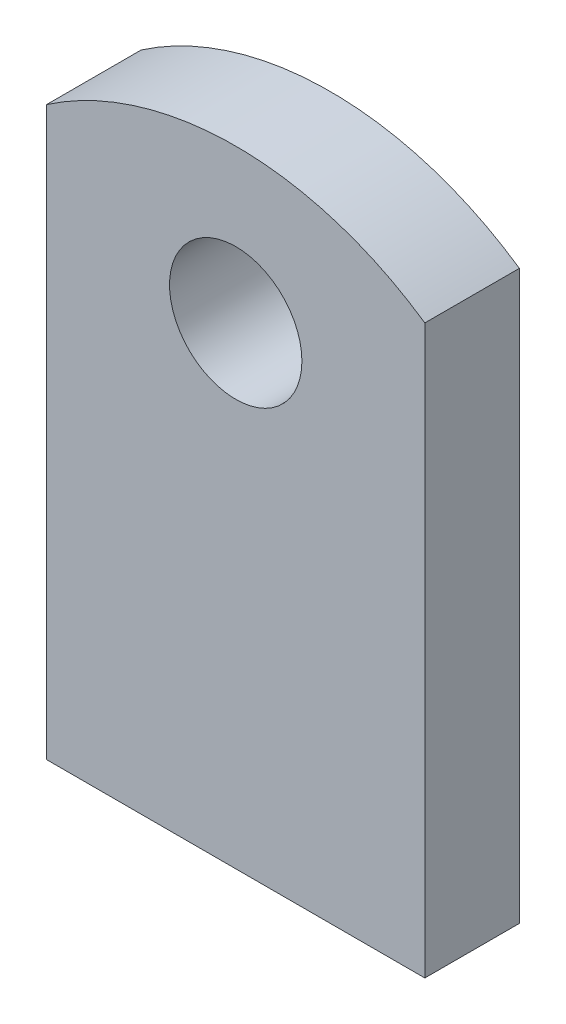
ISO-10303-21;
HEADER;
FILE_DESCRIPTION(('STEP AP214'),'2;1');
FILE_NAME('part.step','',(''),(''),'','','');
FILE_SCHEMA(('AUTOMOTIVE_DESIGN { 1 0 10303 214 1 1 1 1 }'));
ENDSEC;
DATA;
#1=APPLICATION_CONTEXT('core data for automotive mechanical design processes');
#2=APPLICATION_PROTOCOL_DEFINITION('international standard','automotive_design',2000,#1);
#3=PRODUCT_CONTEXT('',#1,'mechanical');
#4=PRODUCT('Part','Part','',(#3));
#5=PRODUCT_RELATED_PRODUCT_CATEGORY('part','',(#4));
#6=PRODUCT_DEFINITION_FORMATION('','',#4);
#7=PRODUCT_DEFINITION_CONTEXT('part definition',#1,'design');
#8=PRODUCT_DEFINITION('design','',#6,#7);
#9=PRODUCT_DEFINITION_SHAPE('','',#8);
#10=(LENGTH_UNIT() NAMED_UNIT(*) SI_UNIT(.MILLI.,.METRE.));
#11=(NAMED_UNIT(*) PLANE_ANGLE_UNIT() SI_UNIT($,.RADIAN.));
#12=(NAMED_UNIT(*) SI_UNIT($,.STERADIAN.) SOLID_ANGLE_UNIT());
#13=UNCERTAINTY_MEASURE_WITH_UNIT(LENGTH_MEASURE(1.E-05),#10,'distance_accuracy_value','');
#14=(GEOMETRIC_REPRESENTATION_CONTEXT(3) GLOBAL_UNCERTAINTY_ASSIGNED_CONTEXT((#13)) GLOBAL_UNIT_ASSIGNED_CONTEXT((#10,
#11,#12)) REPRESENTATION_CONTEXT('',''));
#15=CARTESIAN_POINT('',(0.,0.,0.));
#16=DIRECTION('',(0.,0.,1.));
#17=DIRECTION('',(1.,0.,0.));
#18=AXIS2_PLACEMENT_3D('',#15,#16,#17);
#19=CARTESIAN_POINT('',(0.,0.419794240135012,5.));
#20=DIRECTION('',(0.,0.,-1.));
#21=DIRECTION('',(-1.,0.,0.));
#22=AXIS2_PLACEMENT_3D('',#19,#20,#21);
#23=PLANE('',#22);
#24=CARTESIAN_POINT('',(0.,0.419794240135012,5.));
#25=DIRECTION('',(0.,0.,1.));
#26=DIRECTION('',(-1.,0.,0.));
#27=AXIS2_PLACEMENT_3D('',#24,#25,#26);
#28=CIRCLE('',#27,17.68);
#29=CARTESIAN_POINT('',(10.,15.,5.));
#30=VERTEX_POINT('',#29);
#31=CARTESIAN_POINT('',(-10.,15.,5.));
#32=VERTEX_POINT('',#31);
#33=EDGE_CURVE('E98',#30,#32,#28,.T.);
#34=ORIENTED_EDGE('',*,*,#33,.T.);
#35=DIRECTION('',(0.,-1.,0.));
#36=VECTOR('',#35,1.);
#37=CARTESIAN_POINT('',(-10.,-15.,5.));
#38=LINE('',#37,#36);
#39=CARTESIAN_POINT('',(-10.,-15.,5.));
#40=VERTEX_POINT('',#39);
#41=EDGE_CURVE('E93',#32,#40,#38,.T.);
#42=ORIENTED_EDGE('',*,*,#41,.T.);
#43=DIRECTION('',(1.,0.,0.));
#44=VECTOR('',#43,1.);
#45=CARTESIAN_POINT('',(10.,-15.,5.));
#46=LINE('',#45,#44);
#47=CARTESIAN_POINT('',(10.,-15.,5.));
#48=VERTEX_POINT('',#47);
#49=EDGE_CURVE('E96',#40,#48,#46,.T.);
#50=ORIENTED_EDGE('',*,*,#49,.T.);
#51=DIRECTION('',(0.,1.,0.));
#52=VECTOR('',#51,1.);
#53=CARTESIAN_POINT('',(10.,-15.,5.));
#54=LINE('',#53,#52);
#55=EDGE_CURVE('E63',#48,#30,#54,.T.);
#56=ORIENTED_EDGE('',*,*,#55,.T.);
#57=EDGE_LOOP('',(#34,#42,#50,#56));
#58=FACE_BOUND('',#57,.T.);
#59=CARTESIAN_POINT('',(0.,10.,5.));
#60=DIRECTION('',(0.,0.,1.));
#61=DIRECTION('',(1.,0.,0.));
#62=AXIS2_PLACEMENT_3D('',#59,#60,#61);
#63=CIRCLE('',#62,3.5);
#64=CARTESIAN_POINT('',(3.49999999999999,10.,5.));
#65=VERTEX_POINT('',#64);
#66=EDGE_CURVE('E118',#65,#65,#63,.T.);
#67=ORIENTED_EDGE('',*,*,#66,.F.);
#68=EDGE_LOOP('',(#67));
#69=FACE_BOUND('',#68,.T.);
#70=ADVANCED_FACE('F45',(#58,#69),#23,.F.);
#71=CARTESIAN_POINT('',(0.,0.419794240135012,0.));
#72=DIRECTION('',(0.,0.,-1.));
#73=DIRECTION('',(-1.,0.,0.));
#74=AXIS2_PLACEMENT_3D('',#71,#72,#73);
#75=PLANE('',#74);
#76=CARTESIAN_POINT('',(0.,0.419794240135012,0.));
#77=DIRECTION('',(0.,0.,1.));
#78=DIRECTION('',(-1.,0.,0.));
#79=AXIS2_PLACEMENT_3D('',#76,#77,#78);
#80=CIRCLE('',#79,17.68);
#81=CARTESIAN_POINT('',(10.,15.,0.));
#82=VERTEX_POINT('',#81);
#83=CARTESIAN_POINT('',(-10.,15.,0.));
#84=VERTEX_POINT('',#83);
#85=EDGE_CURVE('E114',#82,#84,#80,.T.);
#86=ORIENTED_EDGE('',*,*,#85,.F.);
#87=DIRECTION('',(0.,1.,0.));
#88=VECTOR('',#87,1.);
#89=CARTESIAN_POINT('',(10.,-15.,0.));
#90=LINE('',#89,#88);
#91=CARTESIAN_POINT('',(10.,-15.,0.));
#92=VERTEX_POINT('',#91);
#93=EDGE_CURVE('E86',#92,#82,#90,.T.);
#94=ORIENTED_EDGE('',*,*,#93,.F.);
#95=DIRECTION('',(1.,0.,0.));
#96=VECTOR('',#95,1.);
#97=CARTESIAN_POINT('',(10.,-15.,0.));
#98=LINE('',#97,#96);
#99=CARTESIAN_POINT('',(-10.,-15.,0.));
#100=VERTEX_POINT('',#99);
#101=EDGE_CURVE('E80',#100,#92,#98,.T.);
#102=ORIENTED_EDGE('',*,*,#101,.F.);
#103=DIRECTION('',(0.,-1.,0.));
#104=VECTOR('',#103,1.);
#105=CARTESIAN_POINT('',(-10.,-15.,0.));
#106=LINE('',#105,#104);
#107=EDGE_CURVE('E103',#84,#100,#106,.T.);
#108=ORIENTED_EDGE('',*,*,#107,.F.);
#109=EDGE_LOOP('',(#86,#94,#102,#108));
#110=FACE_BOUND('',#109,.T.);
#111=CARTESIAN_POINT('',(0.,10.,0.));
#112=DIRECTION('',(0.,0.,1.));
#113=DIRECTION('',(1.,0.,0.));
#114=AXIS2_PLACEMENT_3D('',#111,#112,#113);
#115=CIRCLE('',#114,3.5);
#116=CARTESIAN_POINT('',(3.49999999999999,10.,0.));
#117=VERTEX_POINT('',#116);
#118=EDGE_CURVE('E136',#117,#117,#115,.T.);
#119=ORIENTED_EDGE('',*,*,#118,.T.);
#120=EDGE_LOOP('',(#119));
#121=FACE_BOUND('',#120,.T.);
#122=ADVANCED_FACE('F131',(#110,#121),#75,.T.);
#123=CARTESIAN_POINT('',(0.,0.419794240135012,5.));
#124=DIRECTION('',(0.,0.,-1.));
#125=DIRECTION('',(-1.,0.,0.));
#126=AXIS2_PLACEMENT_3D('',#123,#124,#125);
#127=CYLINDRICAL_SURFACE('',#126,17.68);
#128=ORIENTED_EDGE('',*,*,#85,.T.);
#129=DIRECTION('',(0.,0.,-1.));
#130=VECTOR('',#129,1.);
#131=CARTESIAN_POINT('',(-10.,15.,5.));
#132=LINE('',#131,#130);
#133=EDGE_CURVE('E11',#32,#84,#132,.T.);
#134=ORIENTED_EDGE('',*,*,#133,.F.);
#135=ORIENTED_EDGE('',*,*,#33,.F.);
#136=DIRECTION('',(0.,0.,-1.));
#137=VECTOR('',#136,1.);
#138=CARTESIAN_POINT('',(10.,15.,5.));
#139=LINE('',#138,#137);
#140=EDGE_CURVE('E110',#30,#82,#139,.T.);
#141=ORIENTED_EDGE('',*,*,#140,.T.);
#142=EDGE_LOOP('',(#128,#134,#135,#141));
#143=FACE_BOUND('',#142,.T.);
#144=ADVANCED_FACE('F47',(#143),#127,.T.);
#145=CARTESIAN_POINT('',(-10.,-15.,5.));
#146=DIRECTION('',(1.,0.,0.));
#147=DIRECTION('',(0.,1.,0.));
#148=AXIS2_PLACEMENT_3D('',#145,#146,#147);
#149=PLANE('',#148);
#150=ORIENTED_EDGE('',*,*,#107,.T.);
#151=DIRECTION('',(0.,0.,-1.));
#152=VECTOR('',#151,1.);
#153=CARTESIAN_POINT('',(-10.,-15.,5.));
#154=LINE('',#153,#152);
#155=EDGE_CURVE('E55',#40,#100,#154,.T.);
#156=ORIENTED_EDGE('',*,*,#155,.F.);
#157=ORIENTED_EDGE('',*,*,#41,.F.);
#158=ORIENTED_EDGE('',*,*,#133,.T.);
#159=EDGE_LOOP('',(#150,#156,#157,#158));
#160=FACE_BOUND('',#159,.T.);
#161=ADVANCED_FACE('F102',(#160),#149,.F.);
#162=CARTESIAN_POINT('',(10.,-15.,5.));
#163=DIRECTION('',(0.,1.,0.));
#164=DIRECTION('',(-1.,0.,0.));
#165=AXIS2_PLACEMENT_3D('',#162,#163,#164);
#166=PLANE('',#165);
#167=ORIENTED_EDGE('',*,*,#101,.T.);
#168=DIRECTION('',(0.,0.,-1.));
#169=VECTOR('',#168,1.);
#170=CARTESIAN_POINT('',(10.,-15.,5.));
#171=LINE('',#170,#169);
#172=EDGE_CURVE('E105',#48,#92,#171,.T.);
#173=ORIENTED_EDGE('',*,*,#172,.F.);
#174=ORIENTED_EDGE('',*,*,#49,.F.);
#175=ORIENTED_EDGE('',*,*,#155,.T.);
#176=EDGE_LOOP('',(#167,#173,#174,#175));
#177=FACE_BOUND('',#176,.T.);
#178=ADVANCED_FACE('F106',(#177),#166,.F.);
#179=CARTESIAN_POINT('',(10.,-15.,5.));
#180=DIRECTION('',(-1.,0.,0.));
#181=DIRECTION('',(0.,0.,1.));
#182=AXIS2_PLACEMENT_3D('',#179,#180,#181);
#183=PLANE('',#182);
#184=ORIENTED_EDGE('',*,*,#93,.T.);
#185=ORIENTED_EDGE('',*,*,#140,.F.);
#186=ORIENTED_EDGE('',*,*,#55,.F.);
#187=ORIENTED_EDGE('',*,*,#172,.T.);
#188=EDGE_LOOP('',(#184,#185,#186,#187));
#189=FACE_BOUND('',#188,.T.);
#190=ADVANCED_FACE('F128',(#189),#183,.F.);
#191=CARTESIAN_POINT('',(0.,10.,5.));
#192=DIRECTION('',(0.,0.,-1.));
#193=DIRECTION('',(-1.,0.,0.));
#194=AXIS2_PLACEMENT_3D('',#191,#192,#193);
#195=CYLINDRICAL_SURFACE('',#194,3.5);
#196=ORIENTED_EDGE('',*,*,#66,.T.);
#197=EDGE_LOOP('',(#196));
#198=FACE_BOUND('',#197,.T.);
#199=ORIENTED_EDGE('',*,*,#118,.F.);
#200=EDGE_LOOP('',(#199));
#201=FACE_BOUND('',#200,.T.);
#202=ADVANCED_FACE('F144',(#198,#201),#195,.F.);
#203=CLOSED_SHELL('',(#70,#122,#144,#161,#178,#190,#202));
#204=MANIFOLD_SOLID_BREP('B2',#203);
#205=ADVANCED_BREP_SHAPE_REPRESENTATION('',(#18,#204),#14);
#206=SHAPE_DEFINITION_REPRESENTATION(#9,#205);
ENDSEC;
END-ISO-10303-21;
